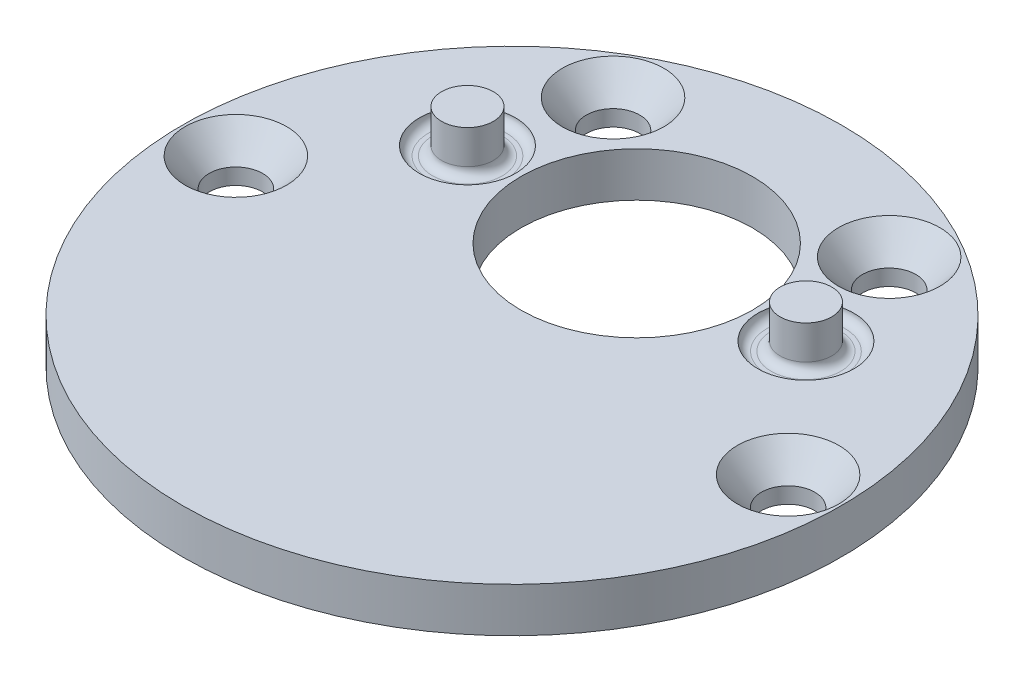
ISO-10303-21;
HEADER;
FILE_DESCRIPTION(('STEP AP214'),'2;1');
FILE_NAME('part.step','',(''),(''),'','','');
FILE_SCHEMA(('AUTOMOTIVE_DESIGN { 1 0 10303 214 1 1 1 1 }'));
ENDSEC;
DATA;
#1=APPLICATION_CONTEXT('core data for automotive mechanical design processes');
#2=APPLICATION_PROTOCOL_DEFINITION('international standard','automotive_design',2000,#1);
#3=PRODUCT_CONTEXT('',#1,'mechanical');
#4=PRODUCT('Part','Part','',(#3));
#5=PRODUCT_RELATED_PRODUCT_CATEGORY('part','',(#4));
#6=PRODUCT_DEFINITION_FORMATION('','',#4);
#7=PRODUCT_DEFINITION_CONTEXT('part definition',#1,'design');
#8=PRODUCT_DEFINITION('design','',#6,#7);
#9=PRODUCT_DEFINITION_SHAPE('','',#8);
#10=(LENGTH_UNIT() NAMED_UNIT(*) SI_UNIT(.MILLI.,.METRE.));
#11=(NAMED_UNIT(*) PLANE_ANGLE_UNIT() SI_UNIT($,.RADIAN.));
#12=(NAMED_UNIT(*) SI_UNIT($,.STERADIAN.) SOLID_ANGLE_UNIT());
#13=UNCERTAINTY_MEASURE_WITH_UNIT(LENGTH_MEASURE(1.E-05),#10,'distance_accuracy_value','');
#14=(GEOMETRIC_REPRESENTATION_CONTEXT(3) GLOBAL_UNCERTAINTY_ASSIGNED_CONTEXT((#13)) GLOBAL_UNIT_ASSIGNED_CONTEXT((#10,
#11,#12)) REPRESENTATION_CONTEXT('',''));
#15=CARTESIAN_POINT('',(0.,0.,0.));
#16=DIRECTION('',(0.,0.,1.));
#17=DIRECTION('',(1.,0.,0.));
#18=AXIS2_PLACEMENT_3D('',#15,#16,#17);
#19=CARTESIAN_POINT('',(0.,2.5,0.));
#20=DIRECTION('',(0.,1.,0.));
#21=DIRECTION('',(0.,0.,1.));
#22=AXIS2_PLACEMENT_3D('',#19,#20,#21);
#23=PLANE('',#22);
#24=CARTESIAN_POINT('',(-15.5,2.5,0.));
#25=DIRECTION('',(0.,1.,0.));
#26=DIRECTION('',(0.,0.,1.));
#27=AXIS2_PLACEMENT_3D('',#24,#25,#26);
#28=CIRCLE('',#27,2.85000000000001);
#29=CARTESIAN_POINT('',(-15.5,2.5,2.85000000000001));
#30=VERTEX_POINT('',#29);
#31=EDGE_CURVE('E66',#30,#30,#28,.F.);
#32=ORIENTED_EDGE('',*,*,#31,.T.);
#33=EDGE_LOOP('',(#32));
#34=FACE_BOUND('',#33,.T.);
#35=CARTESIAN_POINT('',(15.5,2.5,0.));
#36=DIRECTION('',(0.,1.,0.));
#37=DIRECTION('',(0.,0.,1.));
#38=AXIS2_PLACEMENT_3D('',#35,#36,#37);
#39=CIRCLE('',#38,2.85000000000001);
#40=CARTESIAN_POINT('',(15.5,2.5,2.85000000000001));
#41=VERTEX_POINT('',#40);
#42=EDGE_CURVE('E69',#41,#41,#39,.F.);
#43=ORIENTED_EDGE('',*,*,#42,.T.);
#44=EDGE_LOOP('',(#43));
#45=FACE_BOUND('',#44,.T.);
#46=CARTESIAN_POINT('',(7.74999999999997,2.5,-13.4233937586588));
#47=DIRECTION('',(0.,1.,0.));
#48=DIRECTION('',(0.,0.,1.));
#49=AXIS2_PLACEMENT_3D('',#46,#47,#48);
#50=CIRCLE('',#49,2.85);
#51=CARTESIAN_POINT('',(7.74999999999997,2.5,-10.5733937586588));
#52=VERTEX_POINT('',#51);
#53=EDGE_CURVE('E72',#52,#52,#50,.F.);
#54=ORIENTED_EDGE('',*,*,#53,.T.);
#55=EDGE_LOOP('',(#54));
#56=FACE_BOUND('',#55,.T.);
#57=CARTESIAN_POINT('',(-7.74999999999997,2.5,-13.4233937586588));
#58=DIRECTION('',(0.,1.,0.));
#59=DIRECTION('',(0.,0.,1.));
#60=AXIS2_PLACEMENT_3D('',#57,#58,#59);
#61=CIRCLE('',#60,2.85000000000001);
#62=CARTESIAN_POINT('',(-7.74999999999997,2.5,-10.5733937586588));
#63=VERTEX_POINT('',#62);
#64=EDGE_CURVE('E75',#63,#63,#61,.F.);
#65=ORIENTED_EDGE('',*,*,#64,.T.);
#66=EDGE_LOOP('',(#65));
#67=FACE_BOUND('',#66,.T.);
#68=CARTESIAN_POINT('',(0.,2.5,-7.));
#69=DIRECTION('',(0.,1.,0.));
#70=DIRECTION('',(0.,0.,1.));
#71=AXIS2_PLACEMENT_3D('',#68,#69,#70);
#72=CIRCLE('',#71,6.5);
#73=CARTESIAN_POINT('',(0.,2.5,-0.499999999999997));
#74=VERTEX_POINT('',#73);
#75=EDGE_CURVE('E112',#74,#74,#72,.T.);
#76=ORIENTED_EDGE('',*,*,#75,.F.);
#77=EDGE_LOOP('',(#76));
#78=FACE_BOUND('',#77,.T.);
#79=CARTESIAN_POINT('',(-9.5,2.5,-7.));
#80=DIRECTION('',(0.,1.,0.));
#81=DIRECTION('',(0.,0.,1.));
#82=AXIS2_PLACEMENT_3D('',#79,#80,#81);
#83=CIRCLE('',#82,2.7);
#84=CARTESIAN_POINT('',(-9.5,2.5,-4.3));
#85=VERTEX_POINT('',#84);
#86=EDGE_CURVE('E105',#85,#85,#83,.T.);
#87=ORIENTED_EDGE('',*,*,#86,.F.);
#88=EDGE_LOOP('',(#87));
#89=FACE_BOUND('',#88,.T.);
#90=CARTESIAN_POINT('',(9.5,2.5,-7.));
#91=DIRECTION('',(0.,1.,0.));
#92=DIRECTION('',(0.,0.,1.));
#93=AXIS2_PLACEMENT_3D('',#90,#91,#92);
#94=CIRCLE('',#93,2.7);
#95=CARTESIAN_POINT('',(9.5,2.5,-4.3));
#96=VERTEX_POINT('',#95);
#97=EDGE_CURVE('E106',#96,#96,#94,.T.);
#98=ORIENTED_EDGE('',*,*,#97,.F.);
#99=EDGE_LOOP('',(#98));
#100=FACE_BOUND('',#99,.T.);
#101=CARTESIAN_POINT('',(0.,2.5,0.));
#102=DIRECTION('',(0.,1.,0.));
#103=DIRECTION('',(0.,0.,1.));
#104=AXIS2_PLACEMENT_3D('',#101,#102,#103);
#105=CIRCLE('',#104,18.5);
#106=CARTESIAN_POINT('',(0.,2.5,18.5));
#107=VERTEX_POINT('',#106);
#108=EDGE_CURVE('E81',#107,#107,#105,.T.);
#109=ORIENTED_EDGE('',*,*,#108,.T.);
#110=EDGE_LOOP('',(#109));
#111=FACE_BOUND('',#110,.T.);
#112=ADVANCED_FACE('F31',(#34,#45,#56,#67,#78,#89,#100,#111),#23,.T.);
#113=CARTESIAN_POINT('',(0.,0.,0.));
#114=DIRECTION('',(0.,1.,0.));
#115=DIRECTION('',(0.,0.,1.));
#116=AXIS2_PLACEMENT_3D('',#113,#114,#115);
#117=PLANE('',#116);
#118=CARTESIAN_POINT('',(0.,0.,-7.));
#119=DIRECTION('',(0.,1.,0.));
#120=DIRECTION('',(0.,0.,1.));
#121=AXIS2_PLACEMENT_3D('',#118,#119,#120);
#122=CIRCLE('',#121,6.5);
#123=CARTESIAN_POINT('',(0.,0.,-0.499999999999997));
#124=VERTEX_POINT('',#123);
#125=EDGE_CURVE('E109',#124,#124,#122,.T.);
#126=ORIENTED_EDGE('',*,*,#125,.T.);
#127=EDGE_LOOP('',(#126));
#128=FACE_BOUND('',#127,.T.);
#129=CARTESIAN_POINT('',(0.,0.,0.));
#130=DIRECTION('',(0.,1.,0.));
#131=DIRECTION('',(0.,0.,1.));
#132=AXIS2_PLACEMENT_3D('',#129,#130,#131);
#133=CIRCLE('',#132,18.5);
#134=CARTESIAN_POINT('',(0.,0.,18.5));
#135=VERTEX_POINT('',#134);
#136=EDGE_CURVE('E82',#135,#135,#133,.T.);
#137=ORIENTED_EDGE('',*,*,#136,.F.);
#138=EDGE_LOOP('',(#137));
#139=FACE_BOUND('',#138,.T.);
#140=CARTESIAN_POINT('',(-7.74999999999997,0.,-13.4233937586588));
#141=DIRECTION('',(0.,1.,0.));
#142=DIRECTION('',(0.,0.,1.));
#143=AXIS2_PLACEMENT_3D('',#140,#141,#142);
#144=CIRCLE('',#143,1.5);
#145=CARTESIAN_POINT('',(-7.74999999999997,0.,-11.9233937586588));
#146=VERTEX_POINT('',#145);
#147=EDGE_CURVE('E85',#146,#146,#144,.T.);
#148=ORIENTED_EDGE('',*,*,#147,.T.);
#149=EDGE_LOOP('',(#148));
#150=FACE_BOUND('',#149,.T.);
#151=CARTESIAN_POINT('',(-15.5,0.,0.));
#152=DIRECTION('',(0.,1.,0.));
#153=DIRECTION('',(0.,0.,1.));
#154=AXIS2_PLACEMENT_3D('',#151,#152,#153);
#155=CIRCLE('',#154,1.5);
#156=CARTESIAN_POINT('',(-15.5,0.,1.5));
#157=VERTEX_POINT('',#156);
#158=EDGE_CURVE('E90',#157,#157,#155,.T.);
#159=ORIENTED_EDGE('',*,*,#158,.T.);
#160=EDGE_LOOP('',(#159));
#161=FACE_BOUND('',#160,.T.);
#162=CARTESIAN_POINT('',(7.74999999999997,0.,-13.4233937586588));
#163=DIRECTION('',(0.,1.,0.));
#164=DIRECTION('',(0.,0.,1.));
#165=AXIS2_PLACEMENT_3D('',#162,#163,#164);
#166=CIRCLE('',#165,1.5);
#167=CARTESIAN_POINT('',(7.74999999999997,0.,-11.9233937586588));
#168=VERTEX_POINT('',#167);
#169=EDGE_CURVE('E93',#168,#168,#166,.T.);
#170=ORIENTED_EDGE('',*,*,#169,.T.);
#171=EDGE_LOOP('',(#170));
#172=FACE_BOUND('',#171,.T.);
#173=CARTESIAN_POINT('',(15.5,0.,0.));
#174=DIRECTION('',(0.,1.,0.));
#175=DIRECTION('',(0.,0.,1.));
#176=AXIS2_PLACEMENT_3D('',#173,#174,#175);
#177=CIRCLE('',#176,1.5);
#178=CARTESIAN_POINT('',(15.5,0.,1.5));
#179=VERTEX_POINT('',#178);
#180=EDGE_CURVE('E96',#179,#179,#177,.T.);
#181=ORIENTED_EDGE('',*,*,#180,.T.);
#182=EDGE_LOOP('',(#181));
#183=FACE_BOUND('',#182,.T.);
#184=ADVANCED_FACE('F118',(#128,#139,#150,#161,#172,#183),#117,.F.);
#185=CARTESIAN_POINT('',(0.,2.5,0.));
#186=DIRECTION('',(0.,-1.,0.));
#187=DIRECTION('',(0.,0.,-1.));
#188=AXIS2_PLACEMENT_3D('',#185,#186,#187);
#189=CYLINDRICAL_SURFACE('',#188,18.5);
#190=ORIENTED_EDGE('',*,*,#108,.F.);
#191=EDGE_LOOP('',(#190));
#192=FACE_BOUND('',#191,.T.);
#193=ORIENTED_EDGE('',*,*,#136,.T.);
#194=EDGE_LOOP('',(#193));
#195=FACE_BOUND('',#194,.T.);
#196=ADVANCED_FACE('F139',(#192,#195),#189,.T.);
#197=CARTESIAN_POINT('',(-7.74999999999997,2.5,-13.4233937586588));
#198=DIRECTION('',(0.,-1.,0.));
#199=DIRECTION('',(0.,0.,-1.));
#200=AXIS2_PLACEMENT_3D('',#197,#198,#199);
#201=CYLINDRICAL_SURFACE('',#200,1.5);
#202=CARTESIAN_POINT('',(-7.74999999999997,0.899999999999989,-13.4233937586588));
#203=DIRECTION('',(0.,1.,0.));
#204=DIRECTION('',(0.,0.,1.));
#205=AXIS2_PLACEMENT_3D('',#202,#203,#204);
#206=CIRCLE('',#205,1.5);
#207=CARTESIAN_POINT('',(-7.74999999999997,0.899999999999989,-11.9233937586588));
#208=VERTEX_POINT('',#207);
#209=EDGE_CURVE('E57',#208,#208,#206,.T.);
#210=ORIENTED_EDGE('',*,*,#209,.T.);
#211=EDGE_LOOP('',(#210));
#212=FACE_BOUND('',#211,.T.);
#213=ORIENTED_EDGE('',*,*,#147,.F.);
#214=EDGE_LOOP('',(#213));
#215=FACE_BOUND('',#214,.T.);
#216=ADVANCED_FACE('F142',(#212,#215),#201,.F.);
#217=CARTESIAN_POINT('',(-15.5,2.5,0.));
#218=DIRECTION('',(0.,-1.,0.));
#219=DIRECTION('',(0.,0.,-1.));
#220=AXIS2_PLACEMENT_3D('',#217,#218,#219);
#221=CYLINDRICAL_SURFACE('',#220,1.5);
#222=CARTESIAN_POINT('',(-15.5,0.899999999999986,0.));
#223=DIRECTION('',(0.,1.,0.));
#224=DIRECTION('',(0.,0.,1.));
#225=AXIS2_PLACEMENT_3D('',#222,#223,#224);
#226=CIRCLE('',#225,1.5);
#227=CARTESIAN_POINT('',(-15.5,0.899999999999986,1.5));
#228=VERTEX_POINT('',#227);
#229=EDGE_CURVE('E78',#228,#228,#226,.T.);
#230=ORIENTED_EDGE('',*,*,#229,.T.);
#231=EDGE_LOOP('',(#230));
#232=FACE_BOUND('',#231,.T.);
#233=ORIENTED_EDGE('',*,*,#158,.F.);
#234=EDGE_LOOP('',(#233));
#235=FACE_BOUND('',#234,.T.);
#236=ADVANCED_FACE('F169',(#232,#235),#221,.F.);
#237=CARTESIAN_POINT('',(7.74999999999997,2.5,-13.4233937586588));
#238=DIRECTION('',(0.,-1.,0.));
#239=DIRECTION('',(0.,0.,-1.));
#240=AXIS2_PLACEMENT_3D('',#237,#238,#239);
#241=CYLINDRICAL_SURFACE('',#240,1.5);
#242=CARTESIAN_POINT('',(7.74999999999997,0.899999999999983,-13.4233937586588));
#243=DIRECTION('',(0.,1.,0.));
#244=DIRECTION('',(0.,0.,1.));
#245=AXIS2_PLACEMENT_3D('',#242,#243,#244);
#246=CIRCLE('',#245,1.5);
#247=CARTESIAN_POINT('',(7.74999999999997,0.899999999999983,-11.9233937586588));
#248=VERTEX_POINT('',#247);
#249=EDGE_CURVE('E60',#248,#248,#246,.T.);
#250=ORIENTED_EDGE('',*,*,#249,.T.);
#251=EDGE_LOOP('',(#250));
#252=FACE_BOUND('',#251,.T.);
#253=ORIENTED_EDGE('',*,*,#169,.F.);
#254=EDGE_LOOP('',(#253));
#255=FACE_BOUND('',#254,.T.);
#256=ADVANCED_FACE('F159',(#252,#255),#241,.F.);
#257=CARTESIAN_POINT('',(15.5,2.5,0.));
#258=DIRECTION('',(0.,-1.,0.));
#259=DIRECTION('',(0.,0.,-1.));
#260=AXIS2_PLACEMENT_3D('',#257,#258,#259);
#261=CYLINDRICAL_SURFACE('',#260,1.5);
#262=CARTESIAN_POINT('',(15.5,0.899999999999986,0.));
#263=DIRECTION('',(0.,1.,0.));
#264=DIRECTION('',(0.,0.,1.));
#265=AXIS2_PLACEMENT_3D('',#262,#263,#264);
#266=CIRCLE('',#265,1.5);
#267=CARTESIAN_POINT('',(15.5,0.899999999999986,1.5));
#268=VERTEX_POINT('',#267);
#269=EDGE_CURVE('E63',#268,#268,#266,.T.);
#270=ORIENTED_EDGE('',*,*,#269,.T.);
#271=EDGE_LOOP('',(#270));
#272=FACE_BOUND('',#271,.T.);
#273=ORIENTED_EDGE('',*,*,#180,.F.);
#274=EDGE_LOOP('',(#273));
#275=FACE_BOUND('',#274,.T.);
#276=ADVANCED_FACE('F156',(#272,#275),#261,.F.);
#277=CARTESIAN_POINT('',(-9.5,2.,-7.));
#278=DIRECTION('',(0.,1.,0.));
#279=DIRECTION('',(0.,0.,1.));
#280=AXIS2_PLACEMENT_3D('',#277,#278,#279);
#281=PLANE('',#280);
#282=CARTESIAN_POINT('',(-9.5,2.,-7.));
#283=DIRECTION('',(0.,1.,0.));
#284=DIRECTION('',(0.,0.,1.));
#285=AXIS2_PLACEMENT_3D('',#282,#283,#284);
#286=CIRCLE('',#285,2.2);
#287=CARTESIAN_POINT('',(-9.5,2.,-4.8));
#288=VERTEX_POINT('',#287);
#289=EDGE_CURVE('E51',#288,#288,#286,.T.);
#290=ORIENTED_EDGE('',*,*,#289,.T.);
#291=EDGE_LOOP('',(#290));
#292=FACE_BOUND('',#291,.T.);
#293=CARTESIAN_POINT('',(-9.5,2.,-7.));
#294=DIRECTION('',(0.,1.,0.));
#295=DIRECTION('',(0.,0.,1.));
#296=AXIS2_PLACEMENT_3D('',#293,#294,#295);
#297=CIRCLE('',#296,1.95);
#298=CARTESIAN_POINT('',(-9.5,2.,-5.05));
#299=VERTEX_POINT('',#298);
#300=EDGE_CURVE('E54',#299,#299,#297,.F.);
#301=ORIENTED_EDGE('',*,*,#300,.T.);
#302=EDGE_LOOP('',(#301));
#303=FACE_BOUND('',#302,.T.);
#304=ADVANCED_FACE('F158',(#292,#303),#281,.T.);
#305=CARTESIAN_POINT('',(9.5,2.,-7.));
#306=DIRECTION('',(0.,1.,0.));
#307=DIRECTION('',(0.,0.,1.));
#308=AXIS2_PLACEMENT_3D('',#305,#306,#307);
#309=PLANE('',#308);
#310=CARTESIAN_POINT('',(9.5,2.,-7.));
#311=DIRECTION('',(0.,1.,0.));
#312=DIRECTION('',(0.,0.,1.));
#313=AXIS2_PLACEMENT_3D('',#310,#311,#312);
#314=CIRCLE('',#313,2.2);
#315=CARTESIAN_POINT('',(9.5,2.,-4.8));
#316=VERTEX_POINT('',#315);
#317=EDGE_CURVE('E38',#316,#316,#314,.T.);
#318=ORIENTED_EDGE('',*,*,#317,.T.);
#319=EDGE_LOOP('',(#318));
#320=FACE_BOUND('',#319,.T.);
#321=CARTESIAN_POINT('',(9.5,2.,-7.));
#322=DIRECTION('',(0.,1.,0.));
#323=DIRECTION('',(0.,0.,1.));
#324=AXIS2_PLACEMENT_3D('',#321,#322,#323);
#325=CIRCLE('',#324,1.95);
#326=CARTESIAN_POINT('',(9.5,2.,-5.05));
#327=VERTEX_POINT('',#326);
#328=EDGE_CURVE('E42',#327,#327,#325,.F.);
#329=ORIENTED_EDGE('',*,*,#328,.T.);
#330=EDGE_LOOP('',(#329));
#331=FACE_BOUND('',#330,.T.);
#332=ADVANCED_FACE('F166',(#320,#331),#309,.T.);
#333=CARTESIAN_POINT('',(-9.5,4.4,-7.));
#334=DIRECTION('',(0.,1.,0.));
#335=DIRECTION('',(0.,0.,1.));
#336=AXIS2_PLACEMENT_3D('',#333,#334,#335);
#337=PLANE('',#336);
#338=CARTESIAN_POINT('',(-9.5,4.4,-7.));
#339=DIRECTION('',(0.,1.,0.));
#340=DIRECTION('',(0.,0.,1.));
#341=AXIS2_PLACEMENT_3D('',#338,#339,#340);
#342=CIRCLE('',#341,1.45);
#343=CARTESIAN_POINT('',(-9.5,4.4,-5.55));
#344=VERTEX_POINT('',#343);
#345=EDGE_CURVE('E102',#344,#344,#342,.T.);
#346=ORIENTED_EDGE('',*,*,#345,.T.);
#347=EDGE_LOOP('',(#346));
#348=FACE_BOUND('',#347,.T.);
#349=ADVANCED_FACE('F217',(#348),#337,.T.);
#350=CARTESIAN_POINT('',(-9.5,1.5,-7.));
#351=DIRECTION('',(0.,1.,0.));
#352=DIRECTION('',(0.,0.,1.));
#353=AXIS2_PLACEMENT_3D('',#350,#351,#352);
#354=CYLINDRICAL_SURFACE('',#353,1.45);
#355=CARTESIAN_POINT('',(-9.5,2.5,-7.));
#356=DIRECTION('',(0.,1.,0.));
#357=DIRECTION('',(0.,0.,1.));
#358=AXIS2_PLACEMENT_3D('',#355,#356,#357);
#359=CIRCLE('',#358,1.45);
#360=CARTESIAN_POINT('',(-9.5,2.5,-5.55));
#361=VERTEX_POINT('',#360);
#362=EDGE_CURVE('E46',#361,#361,#359,.T.);
#363=ORIENTED_EDGE('',*,*,#362,.T.);
#364=EDGE_LOOP('',(#363));
#365=FACE_BOUND('',#364,.T.);
#366=ORIENTED_EDGE('',*,*,#345,.F.);
#367=EDGE_LOOP('',(#366));
#368=FACE_BOUND('',#367,.T.);
#369=ADVANCED_FACE('F222',(#365,#368),#354,.T.);
#370=CARTESIAN_POINT('',(9.5,4.4,-7.));
#371=DIRECTION('',(0.,1.,0.));
#372=DIRECTION('',(0.,0.,1.));
#373=AXIS2_PLACEMENT_3D('',#370,#371,#372);
#374=PLANE('',#373);
#375=CARTESIAN_POINT('',(9.5,4.4,-7.));
#376=DIRECTION('',(0.,1.,0.));
#377=DIRECTION('',(0.,0.,1.));
#378=AXIS2_PLACEMENT_3D('',#375,#376,#377);
#379=CIRCLE('',#378,1.45);
#380=CARTESIAN_POINT('',(9.5,4.4,-5.55));
#381=VERTEX_POINT('',#380);
#382=EDGE_CURVE('E99',#381,#381,#379,.T.);
#383=ORIENTED_EDGE('',*,*,#382,.T.);
#384=EDGE_LOOP('',(#383));
#385=FACE_BOUND('',#384,.T.);
#386=ADVANCED_FACE('F227',(#385),#374,.T.);
#387=CARTESIAN_POINT('',(9.5,1.5,-7.));
#388=DIRECTION('',(0.,1.,0.));
#389=DIRECTION('',(0.,0.,1.));
#390=AXIS2_PLACEMENT_3D('',#387,#388,#389);
#391=CYLINDRICAL_SURFACE('',#390,1.45);
#392=CARTESIAN_POINT('',(9.5,2.5,-7.));
#393=DIRECTION('',(0.,1.,0.));
#394=DIRECTION('',(0.,0.,1.));
#395=AXIS2_PLACEMENT_3D('',#392,#393,#394);
#396=CIRCLE('',#395,1.45);
#397=CARTESIAN_POINT('',(9.5,2.5,-5.55));
#398=VERTEX_POINT('',#397);
#399=EDGE_CURVE('E10',#398,#398,#396,.T.);
#400=ORIENTED_EDGE('',*,*,#399,.T.);
#401=EDGE_LOOP('',(#400));
#402=FACE_BOUND('',#401,.T.);
#403=ORIENTED_EDGE('',*,*,#382,.F.);
#404=EDGE_LOOP('',(#403));
#405=FACE_BOUND('',#404,.T.);
#406=ADVANCED_FACE('F125',(#402,#405),#391,.T.);
#407=CARTESIAN_POINT('',(0.,0.,-7.));
#408=DIRECTION('',(0.,1.,0.));
#409=DIRECTION('',(0.,0.,1.));
#410=AXIS2_PLACEMENT_3D('',#407,#408,#409);
#411=CYLINDRICAL_SURFACE('',#410,6.5);
#412=ORIENTED_EDGE('',*,*,#125,.F.);
#413=EDGE_LOOP('',(#412));
#414=FACE_BOUND('',#413,.T.);
#415=ORIENTED_EDGE('',*,*,#75,.T.);
#416=EDGE_LOOP('',(#415));
#417=FACE_BOUND('',#416,.T.);
#418=ADVANCED_FACE('F121',(#414,#417),#411,.F.);
#419=CARTESIAN_POINT('',(-15.5,0.899999999999986,0.));
#420=DIRECTION('',(0.,1.,0.));
#421=DIRECTION('',(0.,0.,1.));
#422=AXIS2_PLACEMENT_3D('',#419,#420,#421);
#423=CONICAL_SURFACE('',#422,1.5,0.700854407884451);
#424=ORIENTED_EDGE('',*,*,#31,.F.);
#425=EDGE_LOOP('',(#424));
#426=FACE_BOUND('',#425,.T.);
#427=ORIENTED_EDGE('',*,*,#229,.F.);
#428=EDGE_LOOP('',(#427));
#429=FACE_BOUND('',#428,.T.);
#430=ADVANCED_FACE('F124',(#426,#429),#423,.F.);
#431=CARTESIAN_POINT('',(15.5,0.899999999999986,0.));
#432=DIRECTION('',(0.,1.,0.));
#433=DIRECTION('',(0.,0.,1.));
#434=AXIS2_PLACEMENT_3D('',#431,#432,#433);
#435=CONICAL_SURFACE('',#434,1.5,0.700854407884451);
#436=ORIENTED_EDGE('',*,*,#42,.F.);
#437=EDGE_LOOP('',(#436));
#438=FACE_BOUND('',#437,.T.);
#439=ORIENTED_EDGE('',*,*,#269,.F.);
#440=EDGE_LOOP('',(#439));
#441=FACE_BOUND('',#440,.T.);
#442=ADVANCED_FACE('F183',(#438,#441),#435,.F.);
#443=CARTESIAN_POINT('',(7.74999999999997,0.899999999999983,-13.4233937586588));
#444=DIRECTION('',(0.,1.,0.));
#445=DIRECTION('',(0.,0.,1.));
#446=AXIS2_PLACEMENT_3D('',#443,#444,#445);
#447=CONICAL_SURFACE('',#446,1.5,0.700854407884447);
#448=CARTESIAN_POINT('',(7.74999999999997,2.5,-10.5733937586588));
#449=CARTESIAN_POINT('',(7.74999999999997,2.48333333333333,-10.5874562586588));
#450=CARTESIAN_POINT('',(7.74999999999997,2.46666666666667,-10.6015187586588));
#451=CARTESIAN_POINT('',(7.74999999999997,2.43333333333333,-10.6296437586588));
#452=CARTESIAN_POINT('',(7.74999999999997,2.41666666666667,-10.6437062586588));
#453=CARTESIAN_POINT('',(7.74999999999997,2.38333333333333,-10.6718312586588));
#454=CARTESIAN_POINT('',(7.74999999999997,2.36666666666666,-10.6858937586588));
#455=CARTESIAN_POINT('',(7.74999999999997,2.33333333333333,-10.7140187586588));
#456=CARTESIAN_POINT('',(7.74999999999997,2.31666666666666,-10.7280812586588));
#457=CARTESIAN_POINT('',(7.74999999999997,2.28333333333333,-10.7562062586588));
#458=CARTESIAN_POINT('',(7.74999999999997,2.26666666666666,-10.7702687586588));
#459=CARTESIAN_POINT('',(7.74999999999997,2.23333333333333,-10.7983937586588));
#460=CARTESIAN_POINT('',(7.74999999999997,2.21666666666666,-10.8124562586588));
#461=CARTESIAN_POINT('',(7.74999999999997,2.18333333333333,-10.8405812586588));
#462=CARTESIAN_POINT('',(7.74999999999997,2.16666666666666,-10.8546437586588));
#463=CARTESIAN_POINT('',(7.74999999999997,2.13333333333333,-10.8827687586588));
#464=CARTESIAN_POINT('',(7.74999999999997,2.11666666666666,-10.8968312586588));
#465=CARTESIAN_POINT('',(7.74999999999997,2.08333333333333,-10.9249562586588));
#466=CARTESIAN_POINT('',(7.74999999999997,2.06666666666666,-10.9390187586588));
#467=CARTESIAN_POINT('',(7.74999999999997,2.03333333333333,-10.9671437586588));
#468=CARTESIAN_POINT('',(7.74999999999997,2.01666666666666,-10.9812062586588));
#469=CARTESIAN_POINT('',(7.74999999999997,1.98333333333333,-11.0093312586588));
#470=CARTESIAN_POINT('',(7.74999999999997,1.96666666666666,-11.0233937586588));
#471=CARTESIAN_POINT('',(7.74999999999997,1.93333333333333,-11.0515187586588));
#472=CARTESIAN_POINT('',(7.74999999999997,1.91666666666666,-11.0655812586588));
#473=CARTESIAN_POINT('',(7.74999999999997,1.88333333333333,-11.0937062586588));
#474=CARTESIAN_POINT('',(7.74999999999997,1.86666666666666,-11.1077687586588));
#475=CARTESIAN_POINT('',(7.74999999999997,1.83333333333333,-11.1358937586588));
#476=CARTESIAN_POINT('',(7.74999999999997,1.81666666666666,-11.1499562586588));
#477=CARTESIAN_POINT('',(7.74999999999997,1.78333333333333,-11.1780812586588));
#478=CARTESIAN_POINT('',(7.74999999999997,1.76666666666666,-11.1921437586588));
#479=CARTESIAN_POINT('',(7.74999999999997,1.73333333333333,-11.2202687586588));
#480=CARTESIAN_POINT('',(7.74999999999997,1.71666666666666,-11.2343312586588));
#481=CARTESIAN_POINT('',(7.74999999999997,1.68333333333332,-11.2624562586588));
#482=CARTESIAN_POINT('',(7.74999999999997,1.66666666666666,-11.2765187586588));
#483=CARTESIAN_POINT('',(7.74999999999997,1.63333333333332,-11.3046437586588));
#484=CARTESIAN_POINT('',(7.74999999999997,1.61666666666666,-11.3187062586588));
#485=CARTESIAN_POINT('',(7.74999999999997,1.58333333333332,-11.3468312586588));
#486=CARTESIAN_POINT('',(7.74999999999997,1.56666666666666,-11.3608937586588));
#487=CARTESIAN_POINT('',(7.74999999999997,1.53333333333332,-11.3890187586588));
#488=CARTESIAN_POINT('',(7.74999999999997,1.51666666666666,-11.4030812586588));
#489=CARTESIAN_POINT('',(7.74999999999997,1.48333333333332,-11.4312062586588));
#490=CARTESIAN_POINT('',(7.74999999999997,1.46666666666666,-11.4452687586588));
#491=CARTESIAN_POINT('',(7.74999999999997,1.43333333333332,-11.4733937586588));
#492=CARTESIAN_POINT('',(7.74999999999997,1.41666666666666,-11.4874562586588));
#493=CARTESIAN_POINT('',(7.74999999999997,1.38333333333332,-11.5155812586588));
#494=CARTESIAN_POINT('',(7.74999999999997,1.36666666666665,-11.5296437586588));
#495=CARTESIAN_POINT('',(7.74999999999997,1.33333333333332,-11.5577687586588));
#496=CARTESIAN_POINT('',(7.74999999999997,1.31666666666665,-11.5718312586588));
#497=CARTESIAN_POINT('',(7.74999999999997,1.28333333333332,-11.5999562586588));
#498=CARTESIAN_POINT('',(7.74999999999997,1.26666666666665,-11.6140187586588));
#499=CARTESIAN_POINT('',(7.74999999999997,1.23333333333332,-11.6421437586588));
#500=CARTESIAN_POINT('',(7.74999999999997,1.21666666666665,-11.6562062586588));
#501=CARTESIAN_POINT('',(7.74999999999997,1.18333333333332,-11.6843312586588));
#502=CARTESIAN_POINT('',(7.74999999999997,1.16666666666665,-11.6983937586588));
#503=CARTESIAN_POINT('',(7.74999999999997,1.13333333333332,-11.7265187586588));
#504=CARTESIAN_POINT('',(7.74999999999997,1.11666666666665,-11.7405812586588));
#505=CARTESIAN_POINT('',(7.74999999999997,1.08333333333332,-11.7687062586588));
#506=CARTESIAN_POINT('',(7.74999999999997,1.06666666666665,-11.7827687586588));
#507=CARTESIAN_POINT('',(7.74999999999997,1.03333333333332,-11.8108937586588));
#508=CARTESIAN_POINT('',(7.74999999999997,1.01666666666665,-11.8249562586588));
#509=CARTESIAN_POINT('',(7.74999999999997,0.983333333333318,-11.8530812586588));
#510=CARTESIAN_POINT('',(7.74999999999997,0.966666666666651,-11.8671437586588));
#511=CARTESIAN_POINT('',(7.74999999999997,0.933333333333317,-11.8952687586588));
#512=CARTESIAN_POINT('',(7.74999999999997,0.91666666666665,-11.9093312586588));
#513=CARTESIAN_POINT('',(7.74999999999997,0.899999999999983,-11.9233937586588));
#514=B_SPLINE_CURVE_WITH_KNOTS('',3,(#448,#449,#450,#451,#452,#453,#454,#455,#456,#457,#458,
#459,#460,#461,#462,#463,#464,#465,#466,#467,#468,#469,#470,#471,#472,#473,#474,#475,#476,#477,
#478,#479,#480,#481,#482,#483,#484,#485,#486,#487,#488,#489,#490,#491,#492,#493,#494,#495,#496,
#497,#498,#499,#500,#501,#502,#503,#504,#505,#506,#507,#508,#509,#510,#511,#512,#513),
.UNSPECIFIED.,.F.,.F.,(4,2,2,2,2,2,2,2,2,2,2,2,2,2,2,2,2,2,2,2,2,2,2,2,2,2,2,2,2,2,2,2,4),(0.,
0.0654200669233081,0.130840133846616,0.196260200769923,0.261680267693231,0.327100334616539,
0.392520401539847,0.457940468463155,0.523360535386461,0.588780602309769,0.654200669233078,
0.719620736156386,0.785040803079694,0.850460870003001,0.915880936926309,0.981301003849617,
1.04672107077292,1.11214113769623,1.17756120461954,1.24298127154285,1.30840133846616,
1.37382140538946,1.43924147231277,1.50466153923608,1.57008160615939,1.6355016730827,
1.700921740006,1.76634180692931,1.83176187385262,1.89718194077593,1.96260200769923,
2.02802207462254,2.09344214154585),.UNSPECIFIED.);
#515=EDGE_CURVE('BSEAM187',#52,#248,#514,.T.);
#516=ORIENTED_EDGE('',*,*,#53,.F.);
#517=ORIENTED_EDGE('',*,*,#249,.F.);
#518=ORIENTED_EDGE('',*,*,#515,.T.);
#519=ORIENTED_EDGE('',*,*,#515,.F.);
#520=EDGE_LOOP('',(#516,#518,#517,#519));
#521=FACE_BOUND('',#520,.T.);
#522=ADVANCED_FACE('F187',(#521),#447,.F.);
#523=CARTESIAN_POINT('',(-7.74999999999997,0.899999999999989,-13.4233937586588));
#524=DIRECTION('',(0.,1.,0.));
#525=DIRECTION('',(0.,0.,1.));
#526=AXIS2_PLACEMENT_3D('',#523,#524,#525);
#527=CONICAL_SURFACE('',#526,1.5,0.700854407884449);
#528=ORIENTED_EDGE('',*,*,#64,.F.);
#529=EDGE_LOOP('',(#528));
#530=FACE_BOUND('',#529,.T.);
#531=ORIENTED_EDGE('',*,*,#209,.F.);
#532=EDGE_LOOP('',(#531));
#533=FACE_BOUND('',#532,.T.);
#534=ADVANCED_FACE('F191',(#530,#533),#527,.F.);
#535=CARTESIAN_POINT('',(-9.5,2.5,-7.));
#536=DIRECTION('',(0.,1.,0.));
#537=DIRECTION('',(0.,0.,1.));
#538=AXIS2_PLACEMENT_3D('',#535,#536,#537);
#539=TOROIDAL_SURFACE('',#538,2.2,0.5);
#540=ORIENTED_EDGE('',*,*,#86,.T.);
#541=EDGE_LOOP('',(#540));
#542=FACE_BOUND('',#541,.T.);
#543=ORIENTED_EDGE('',*,*,#289,.F.);
#544=EDGE_LOOP('',(#543));
#545=FACE_BOUND('',#544,.T.);
#546=ADVANCED_FACE('F195',(#542,#545),#539,.F.);
#547=CARTESIAN_POINT('',(-9.5,2.5,-7.));
#548=DIRECTION('',(0.,1.,0.));
#549=DIRECTION('',(0.,0.,1.));
#550=AXIS2_PLACEMENT_3D('',#547,#548,#549);
#551=TOROIDAL_SURFACE('',#550,1.95,0.5);
#552=ORIENTED_EDGE('',*,*,#300,.F.);
#553=EDGE_LOOP('',(#552));
#554=FACE_BOUND('',#553,.T.);
#555=ORIENTED_EDGE('',*,*,#362,.F.);
#556=EDGE_LOOP('',(#555));
#557=FACE_BOUND('',#556,.T.);
#558=ADVANCED_FACE('F199',(#554,#557),#551,.F.);
#559=CARTESIAN_POINT('',(9.5,2.5,-7.));
#560=DIRECTION('',(0.,1.,0.));
#561=DIRECTION('',(0.,0.,1.));
#562=AXIS2_PLACEMENT_3D('',#559,#560,#561);
#563=TOROIDAL_SURFACE('',#562,2.2,0.5);
#564=ORIENTED_EDGE('',*,*,#97,.T.);
#565=EDGE_LOOP('',(#564));
#566=FACE_BOUND('',#565,.T.);
#567=ORIENTED_EDGE('',*,*,#317,.F.);
#568=EDGE_LOOP('',(#567));
#569=FACE_BOUND('',#568,.T.);
#570=ADVANCED_FACE('F202',(#566,#569),#563,.F.);
#571=CARTESIAN_POINT('',(9.5,2.5,-7.));
#572=DIRECTION('',(0.,1.,0.));
#573=DIRECTION('',(0.,0.,1.));
#574=AXIS2_PLACEMENT_3D('',#571,#572,#573);
#575=TOROIDAL_SURFACE('',#574,1.95,0.5);
#576=ORIENTED_EDGE('',*,*,#328,.F.);
#577=EDGE_LOOP('',(#576));
#578=FACE_BOUND('',#577,.T.);
#579=ORIENTED_EDGE('',*,*,#399,.F.);
#580=EDGE_LOOP('',(#579));
#581=FACE_BOUND('',#580,.T.);
#582=ADVANCED_FACE('F33',(#578,#581),#575,.F.);
#583=CLOSED_SHELL('',(#112,#184,#196,#216,#236,#256,#276,#304,#332,#349,#369,#386,#406,#418,
#430,#442,#522,#534,#546,#558,#570,#582));
#584=MANIFOLD_SOLID_BREP('B2',#583);
#585=ADVANCED_BREP_SHAPE_REPRESENTATION('',(#18,#584),#14);
#586=SHAPE_DEFINITION_REPRESENTATION(#9,#585);
ENDSEC;
END-ISO-10303-21;
